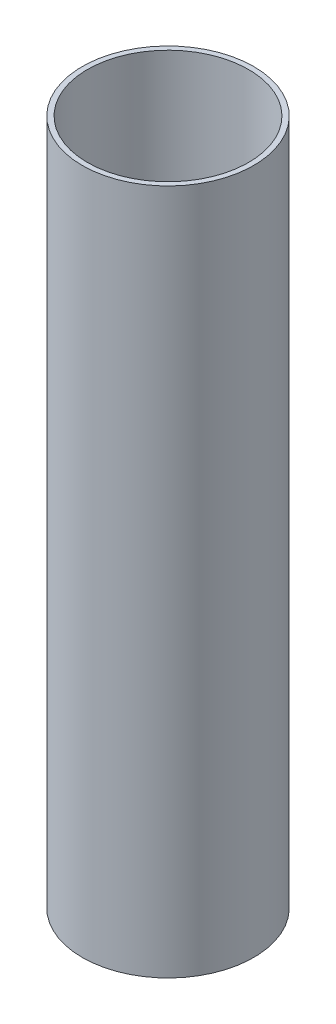
ISO-10303-21;
HEADER;
FILE_DESCRIPTION(('STEP AP214'),'2;1');
FILE_NAME('part.step','',(''),(''),'','','');
FILE_SCHEMA(('AUTOMOTIVE_DESIGN { 1 0 10303 214 1 1 1 1 }'));
ENDSEC;
DATA;
#1=APPLICATION_CONTEXT('core data for automotive mechanical design processes');
#2=APPLICATION_PROTOCOL_DEFINITION('international standard','automotive_design',2000,#1);
#3=PRODUCT_CONTEXT('',#1,'mechanical');
#4=PRODUCT('Part','Part','',(#3));
#5=PRODUCT_RELATED_PRODUCT_CATEGORY('part','',(#4));
#6=PRODUCT_DEFINITION_FORMATION('','',#4);
#7=PRODUCT_DEFINITION_CONTEXT('part definition',#1,'design');
#8=PRODUCT_DEFINITION('design','',#6,#7);
#9=PRODUCT_DEFINITION_SHAPE('','',#8);
#10=(LENGTH_UNIT() NAMED_UNIT(*) SI_UNIT(.MILLI.,.METRE.));
#11=(NAMED_UNIT(*) PLANE_ANGLE_UNIT() SI_UNIT($,.RADIAN.));
#12=(NAMED_UNIT(*) SI_UNIT($,.STERADIAN.) SOLID_ANGLE_UNIT());
#13=UNCERTAINTY_MEASURE_WITH_UNIT(LENGTH_MEASURE(1.E-05),#10,'distance_accuracy_value','');
#14=(GEOMETRIC_REPRESENTATION_CONTEXT(3) GLOBAL_UNCERTAINTY_ASSIGNED_CONTEXT((#13)) GLOBAL_UNIT_ASSIGNED_CONTEXT((#10,
#11,#12)) REPRESENTATION_CONTEXT('',''));
#15=CARTESIAN_POINT('',(0.,0.,0.));
#16=DIRECTION('',(0.,0.,1.));
#17=DIRECTION('',(1.,0.,0.));
#18=AXIS2_PLACEMENT_3D('',#15,#16,#17);
#19=CARTESIAN_POINT('',(0.,200.,0.));
#20=DIRECTION('',(0.,1.,0.));
#21=DIRECTION('',(0.,0.,1.));
#22=AXIS2_PLACEMENT_3D('',#19,#20,#21);
#23=PLANE('',#22);
#24=CARTESIAN_POINT('',(0.,200.,0.));
#25=DIRECTION('',(0.,1.,0.));
#26=DIRECTION('',(0.,0.,1.));
#27=AXIS2_PLACEMENT_3D('',#24,#25,#26);
#28=CIRCLE('',#27,25.);
#29=CARTESIAN_POINT('',(0.,200.,25.));
#30=VERTEX_POINT('',#29);
#31=EDGE_CURVE('E10',#30,#30,#28,.T.);
#32=ORIENTED_EDGE('',*,*,#31,.T.);
#33=EDGE_LOOP('',(#32));
#34=FACE_BOUND('',#33,.T.);
#35=CARTESIAN_POINT('',(0.,200.,0.));
#36=DIRECTION('',(0.,1.,0.));
#37=DIRECTION('',(0.,0.,1.));
#38=AXIS2_PLACEMENT_3D('',#35,#36,#37);
#39=CIRCLE('',#38,23.5);
#40=CARTESIAN_POINT('',(0.,200.,23.5));
#41=VERTEX_POINT('',#40);
#42=EDGE_CURVE('E50',#41,#41,#39,.T.);
#43=ORIENTED_EDGE('',*,*,#42,.F.);
#44=EDGE_LOOP('',(#43));
#45=FACE_BOUND('',#44,.T.);
#46=ADVANCED_FACE('F37',(#34,#45),#23,.T.);
#47=CARTESIAN_POINT('',(0.,0.,0.));
#48=DIRECTION('',(0.,1.,0.));
#49=DIRECTION('',(0.,0.,1.));
#50=AXIS2_PLACEMENT_3D('',#47,#48,#49);
#51=PLANE('',#50);
#52=CARTESIAN_POINT('',(0.,0.,0.));
#53=DIRECTION('',(0.,1.,0.));
#54=DIRECTION('',(0.,0.,1.));
#55=AXIS2_PLACEMENT_3D('',#52,#53,#54);
#56=CIRCLE('',#55,25.);
#57=CARTESIAN_POINT('',(0.,0.,25.));
#58=VERTEX_POINT('',#57);
#59=EDGE_CURVE('E41',#58,#58,#56,.T.);
#60=ORIENTED_EDGE('',*,*,#59,.F.);
#61=EDGE_LOOP('',(#60));
#62=FACE_BOUND('',#61,.T.);
#63=CARTESIAN_POINT('',(0.,0.,0.));
#64=DIRECTION('',(0.,1.,0.));
#65=DIRECTION('',(0.,0.,1.));
#66=AXIS2_PLACEMENT_3D('',#63,#64,#65);
#67=CIRCLE('',#66,23.5);
#68=CARTESIAN_POINT('',(0.,0.,23.5));
#69=VERTEX_POINT('',#68);
#70=EDGE_CURVE('E52',#69,#69,#67,.T.);
#71=ORIENTED_EDGE('',*,*,#70,.T.);
#72=EDGE_LOOP('',(#71));
#73=FACE_BOUND('',#72,.T.);
#74=ADVANCED_FACE('F64',(#62,#73),#51,.F.);
#75=CARTESIAN_POINT('',(0.,200.,0.));
#76=DIRECTION('',(0.,-1.,0.));
#77=DIRECTION('',(0.,0.,-1.));
#78=AXIS2_PLACEMENT_3D('',#75,#76,#77);
#79=CYLINDRICAL_SURFACE('',#78,25.);
#80=ORIENTED_EDGE('',*,*,#31,.F.);
#81=EDGE_LOOP('',(#80));
#82=FACE_BOUND('',#81,.T.);
#83=ORIENTED_EDGE('',*,*,#59,.T.);
#84=EDGE_LOOP('',(#83));
#85=FACE_BOUND('',#84,.T.);
#86=ADVANCED_FACE('F39',(#82,#85),#79,.T.);
#87=CARTESIAN_POINT('',(0.,200.,0.));
#88=DIRECTION('',(0.,-1.,0.));
#89=DIRECTION('',(0.,0.,-1.));
#90=AXIS2_PLACEMENT_3D('',#87,#88,#89);
#91=CYLINDRICAL_SURFACE('',#90,23.5);
#92=ORIENTED_EDGE('',*,*,#42,.T.);
#93=EDGE_LOOP('',(#92));
#94=FACE_BOUND('',#93,.T.);
#95=ORIENTED_EDGE('',*,*,#70,.F.);
#96=EDGE_LOOP('',(#95));
#97=FACE_BOUND('',#96,.T.);
#98=ADVANCED_FACE('F60',(#94,#97),#91,.F.);
#99=CLOSED_SHELL('',(#46,#74,#86,#98));
#100=MANIFOLD_SOLID_BREP('B2',#99);
#101=ADVANCED_BREP_SHAPE_REPRESENTATION('',(#18,#100),#14);
#102=SHAPE_DEFINITION_REPRESENTATION(#9,#101);
ENDSEC;
END-ISO-10303-21;
